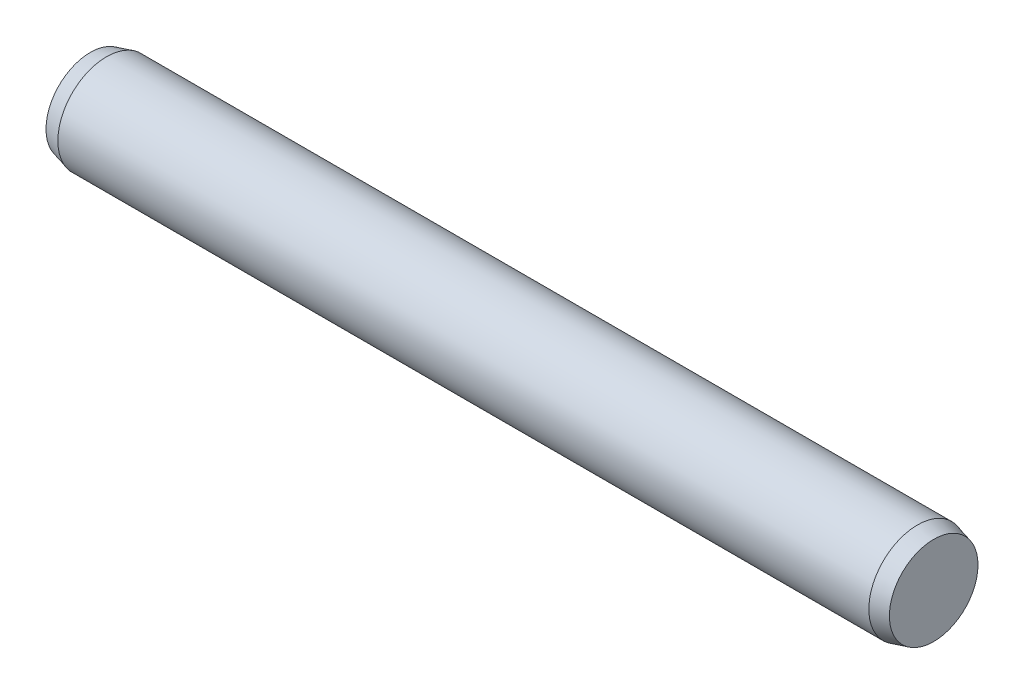
ISO-10303-21;
HEADER;
FILE_DESCRIPTION(('STEP AP214'),'2;1');
FILE_NAME('part.step','',(''),(''),'','','');
FILE_SCHEMA(('AUTOMOTIVE_DESIGN { 1 0 10303 214 1 1 1 1 }'));
ENDSEC;
DATA;
#1=APPLICATION_CONTEXT('core data for automotive mechanical design processes');
#2=APPLICATION_PROTOCOL_DEFINITION('international standard','automotive_design',2000,#1);
#3=PRODUCT_CONTEXT('',#1,'mechanical');
#4=PRODUCT('Part','Part','',(#3));
#5=PRODUCT_RELATED_PRODUCT_CATEGORY('part','',(#4));
#6=PRODUCT_DEFINITION_FORMATION('','',#4);
#7=PRODUCT_DEFINITION_CONTEXT('part definition',#1,'design');
#8=PRODUCT_DEFINITION('design','',#6,#7);
#9=PRODUCT_DEFINITION_SHAPE('','',#8);
#10=(LENGTH_UNIT() NAMED_UNIT(*) SI_UNIT(.MILLI.,.METRE.));
#11=(NAMED_UNIT(*) PLANE_ANGLE_UNIT() SI_UNIT($,.RADIAN.));
#12=(NAMED_UNIT(*) SI_UNIT($,.STERADIAN.) SOLID_ANGLE_UNIT());
#13=UNCERTAINTY_MEASURE_WITH_UNIT(LENGTH_MEASURE(1.E-05),#10,'distance_accuracy_value','');
#14=(GEOMETRIC_REPRESENTATION_CONTEXT(3) GLOBAL_UNCERTAINTY_ASSIGNED_CONTEXT((#13)) GLOBAL_UNIT_ASSIGNED_CONTEXT((#10,
#11,#12)) REPRESENTATION_CONTEXT('',''));
#15=CARTESIAN_POINT('',(0.,0.,0.));
#16=DIRECTION('',(0.,0.,1.));
#17=DIRECTION('',(1.,0.,0.));
#18=AXIS2_PLACEMENT_3D('',#15,#16,#17);
#19=CARTESIAN_POINT('',(-12.5,0.,0.));
#20=DIRECTION('',(1.,0.,0.));
#21=DIRECTION('',(0.,0.,-1.));
#22=AXIS2_PLACEMENT_3D('',#19,#20,#21);
#23=CYLINDRICAL_SURFACE('',#22,1.5);
#24=CARTESIAN_POINT('',(-12.5,0.,0.));
#25=DIRECTION('',(-1.,0.,0.));
#26=DIRECTION('',(0.,0.,1.));
#27=AXIS2_PLACEMENT_3D('',#24,#25,#26);
#28=CIRCLE('',#27,1.5);
#29=CARTESIAN_POINT('',(-12.5,0.,1.5));
#30=VERTEX_POINT('',#29);
#31=EDGE_CURVE('E46',#30,#30,#28,.T.);
#32=ORIENTED_EDGE('',*,*,#31,.F.);
#33=EDGE_LOOP('',(#32));
#34=FACE_BOUND('',#33,.T.);
#35=CARTESIAN_POINT('',(12.5,0.,0.));
#36=DIRECTION('',(1.,0.,0.));
#37=DIRECTION('',(0.,0.,-1.));
#38=AXIS2_PLACEMENT_3D('',#35,#36,#37);
#39=CIRCLE('',#38,1.5);
#40=CARTESIAN_POINT('',(12.5,0.,-1.5));
#41=VERTEX_POINT('',#40);
#42=EDGE_CURVE('E10',#41,#41,#39,.T.);
#43=ORIENTED_EDGE('',*,*,#42,.F.);
#44=EDGE_LOOP('',(#43));
#45=FACE_BOUND('',#44,.T.);
#46=ADVANCED_FACE('F32',(#34,#45),#23,.T.);
#47=CARTESIAN_POINT('',(12.5,0.,0.));
#48=DIRECTION('',(-1.,0.,0.));
#49=DIRECTION('',(0.,0.,-1.));
#50=AXIS2_PLACEMENT_3D('',#47,#48,#49);
#51=CONICAL_SURFACE('',#50,1.5,0.26179938779915);
#52=CARTESIAN_POINT('',(13.,0.,0.));
#53=DIRECTION('',(1.,0.,0.));
#54=DIRECTION('',(0.,0.,-1.));
#55=AXIS2_PLACEMENT_3D('',#52,#53,#54);
#56=CIRCLE('',#55,1.36602540378444);
#57=CARTESIAN_POINT('',(13.,0.,-1.36602540378444));
#58=VERTEX_POINT('',#57);
#59=EDGE_CURVE('E38',#58,#58,#56,.T.);
#60=ORIENTED_EDGE('',*,*,#59,.F.);
#61=EDGE_LOOP('',(#60));
#62=FACE_BOUND('',#61,.T.);
#63=ORIENTED_EDGE('',*,*,#42,.T.);
#64=EDGE_LOOP('',(#63));
#65=FACE_BOUND('',#64,.T.);
#66=ADVANCED_FACE('F56',(#62,#65),#51,.T.);
#67=CARTESIAN_POINT('',(13.,0.,0.));
#68=DIRECTION('',(1.,0.,0.));
#69=DIRECTION('',(0.,0.,-1.));
#70=AXIS2_PLACEMENT_3D('',#67,#68,#69);
#71=PLANE('',#70);
#72=ORIENTED_EDGE('',*,*,#59,.T.);
#73=EDGE_LOOP('',(#72));
#74=FACE_BOUND('',#73,.T.);
#75=ADVANCED_FACE('F60',(#74),#71,.T.);
#76=CARTESIAN_POINT('',(-12.5,0.,0.));
#77=DIRECTION('',(1.,0.,0.));
#78=DIRECTION('',(0.,0.,1.));
#79=AXIS2_PLACEMENT_3D('',#76,#77,#78);
#80=CONICAL_SURFACE('',#79,1.5,0.26179938779915);
#81=CARTESIAN_POINT('',(-13.,0.,0.));
#82=DIRECTION('',(-1.,0.,0.));
#83=DIRECTION('',(0.,0.,1.));
#84=AXIS2_PLACEMENT_3D('',#81,#82,#83);
#85=CIRCLE('',#84,1.36602540378444);
#86=CARTESIAN_POINT('',(-13.,0.,1.36602540378444));
#87=VERTEX_POINT('',#86);
#88=EDGE_CURVE('E42',#87,#87,#85,.T.);
#89=ORIENTED_EDGE('',*,*,#88,.F.);
#90=EDGE_LOOP('',(#89));
#91=FACE_BOUND('',#90,.T.);
#92=ORIENTED_EDGE('',*,*,#31,.T.);
#93=EDGE_LOOP('',(#92));
#94=FACE_BOUND('',#93,.T.);
#95=ADVANCED_FACE('F52',(#91,#94),#80,.T.);
#96=CARTESIAN_POINT('',(-13.,0.,0.));
#97=DIRECTION('',(-1.,0.,0.));
#98=DIRECTION('',(0.,0.,1.));
#99=AXIS2_PLACEMENT_3D('',#96,#97,#98);
#100=PLANE('',#99);
#101=ORIENTED_EDGE('',*,*,#88,.T.);
#102=EDGE_LOOP('',(#101));
#103=FACE_BOUND('',#102,.T.);
#104=ADVANCED_FACE('F69',(#103),#100,.T.);
#105=CLOSED_SHELL('',(#46,#66,#75,#95,#104));
#106=MANIFOLD_SOLID_BREP('B2',#105);
#107=ADVANCED_BREP_SHAPE_REPRESENTATION('',(#18,#106),#14);
#108=SHAPE_DEFINITION_REPRESENTATION(#9,#107);
ENDSEC;
END-ISO-10303-21;
